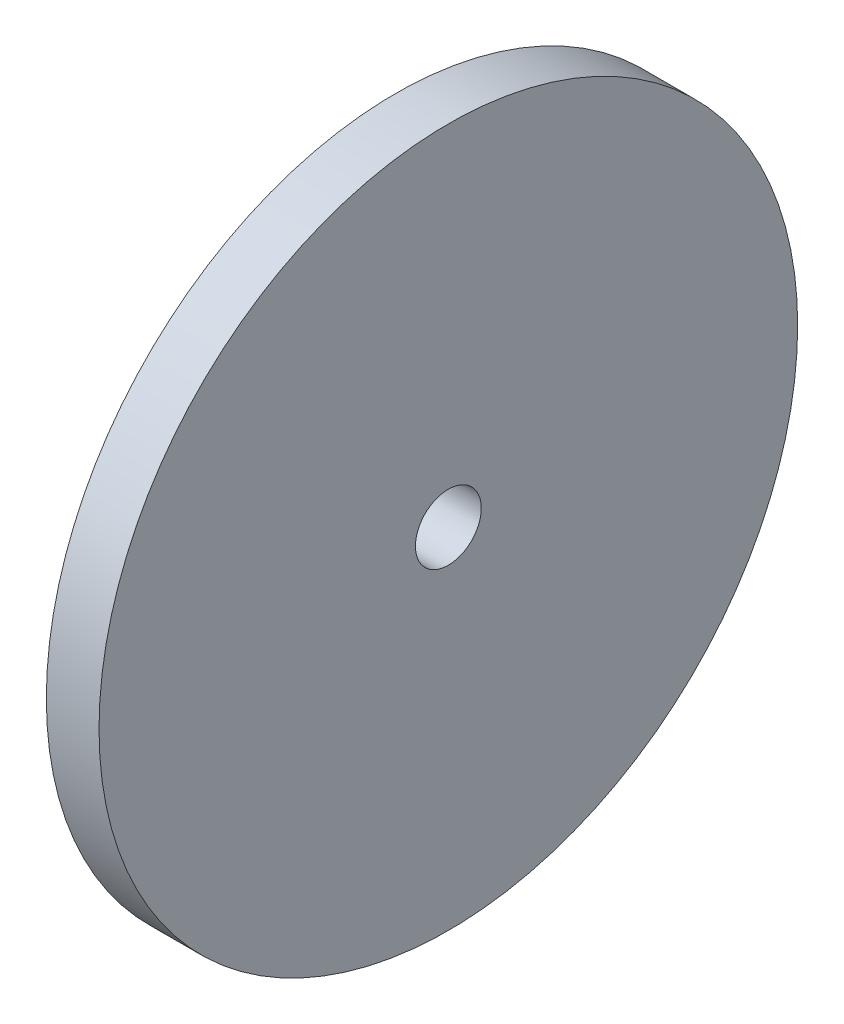
ISO-10303-21;
HEADER;
FILE_DESCRIPTION(('STEP AP214'),'2;1');
FILE_NAME('part.step','',(''),(''),'','','');
FILE_SCHEMA(('AUTOMOTIVE_DESIGN { 1 0 10303 214 1 1 1 1 }'));
ENDSEC;
DATA;
#1=APPLICATION_CONTEXT('core data for automotive mechanical design processes');
#2=APPLICATION_PROTOCOL_DEFINITION('international standard','automotive_design',2000,#1);
#3=PRODUCT_CONTEXT('',#1,'mechanical');
#4=PRODUCT('Part','Part','',(#3));
#5=PRODUCT_RELATED_PRODUCT_CATEGORY('part','',(#4));
#6=PRODUCT_DEFINITION_FORMATION('','',#4);
#7=PRODUCT_DEFINITION_CONTEXT('part definition',#1,'design');
#8=PRODUCT_DEFINITION('design','',#6,#7);
#9=PRODUCT_DEFINITION_SHAPE('','',#8);
#10=(LENGTH_UNIT() NAMED_UNIT(*) SI_UNIT(.MILLI.,.METRE.));
#11=(NAMED_UNIT(*) PLANE_ANGLE_UNIT() SI_UNIT($,.RADIAN.));
#12=(NAMED_UNIT(*) SI_UNIT($,.STERADIAN.) SOLID_ANGLE_UNIT());
#13=UNCERTAINTY_MEASURE_WITH_UNIT(LENGTH_MEASURE(1.E-05),#10,'distance_accuracy_value','');
#14=(GEOMETRIC_REPRESENTATION_CONTEXT(3) GLOBAL_UNCERTAINTY_ASSIGNED_CONTEXT((#13)) GLOBAL_UNIT_ASSIGNED_CONTEXT((#10,
#11,#12)) REPRESENTATION_CONTEXT('',''));
#15=CARTESIAN_POINT('',(0.,0.,0.));
#16=DIRECTION('',(0.,0.,1.));
#17=DIRECTION('',(1.,0.,0.));
#18=AXIS2_PLACEMENT_3D('',#15,#16,#17);
#19=CARTESIAN_POINT('',(0.,0.,0.));
#20=DIRECTION('',(1.,0.,0.));
#21=DIRECTION('',(0.,0.,-1.));
#22=AXIS2_PLACEMENT_3D('',#19,#20,#21);
#23=PLANE('',#22);
#24=CARTESIAN_POINT('',(0.,0.,0.));
#25=DIRECTION('',(-1.,0.,0.));
#26=DIRECTION('',(0.,0.,1.));
#27=AXIS2_PLACEMENT_3D('',#24,#25,#26);
#28=CIRCLE('',#27,1.5875);
#29=CARTESIAN_POINT('',(0.,0.,1.5875));
#30=VERTEX_POINT('',#29);
#31=EDGE_CURVE('E27',#30,#30,#28,.F.);
#32=ORIENTED_EDGE('',*,*,#31,.T.);
#33=EDGE_LOOP('',(#32));
#34=FACE_BOUND('',#33,.T.);
#35=CARTESIAN_POINT('',(0.,0.,0.));
#36=DIRECTION('',(-1.,0.,0.));
#37=DIRECTION('',(0.,0.,1.));
#38=AXIS2_PLACEMENT_3D('',#35,#36,#37);
#39=CIRCLE('',#38,16.843999967);
#40=CARTESIAN_POINT('',(0.,0.,16.843999967));
#41=VERTEX_POINT('',#40);
#42=EDGE_CURVE('E18',#41,#41,#39,.F.);
#43=ORIENTED_EDGE('',*,*,#42,.F.);
#44=EDGE_LOOP('',(#43));
#45=FACE_BOUND('',#44,.T.);
#46=ADVANCED_FACE('F15',(#34,#45),#23,.F.);
#47=CARTESIAN_POINT('',(2.54,0.,0.));
#48=DIRECTION('',(-1.,0.,0.));
#49=DIRECTION('',(0.,0.,1.));
#50=AXIS2_PLACEMENT_3D('',#47,#48,#49);
#51=CYLINDRICAL_SURFACE('',#50,16.843999967);
#52=ORIENTED_EDGE('',*,*,#42,.T.);
#53=EDGE_LOOP('',(#52));
#54=FACE_BOUND('',#53,.T.);
#55=CARTESIAN_POINT('',(2.54,0.,0.));
#56=DIRECTION('',(-1.,0.,0.));
#57=DIRECTION('',(0.,0.,1.));
#58=AXIS2_PLACEMENT_3D('',#55,#56,#57);
#59=CIRCLE('',#58,16.843999967);
#60=CARTESIAN_POINT('',(2.54,0.,16.843999967));
#61=VERTEX_POINT('',#60);
#62=EDGE_CURVE('E22',#61,#61,#59,.F.);
#63=ORIENTED_EDGE('',*,*,#62,.F.);
#64=EDGE_LOOP('',(#63));
#65=FACE_BOUND('',#64,.T.);
#66=ADVANCED_FACE('F35',(#54,#65),#51,.T.);
#67=CARTESIAN_POINT('',(2.54,0.,0.));
#68=DIRECTION('',(-1.,0.,0.));
#69=DIRECTION('',(0.,0.,1.));
#70=AXIS2_PLACEMENT_3D('',#67,#68,#69);
#71=CYLINDRICAL_SURFACE('',#70,1.5875);
#72=CARTESIAN_POINT('',(2.54,0.,0.));
#73=DIRECTION('',(-1.,0.,0.));
#74=DIRECTION('',(0.,0.,1.));
#75=AXIS2_PLACEMENT_3D('',#72,#73,#74);
#76=CIRCLE('',#75,1.5875);
#77=CARTESIAN_POINT('',(2.54,0.,1.5875));
#78=VERTEX_POINT('',#77);
#79=EDGE_CURVE('E10',#78,#78,#76,.T.);
#80=ORIENTED_EDGE('',*,*,#79,.F.);
#81=EDGE_LOOP('',(#80));
#82=FACE_BOUND('',#81,.T.);
#83=ORIENTED_EDGE('',*,*,#31,.F.);
#84=EDGE_LOOP('',(#83));
#85=FACE_BOUND('',#84,.T.);
#86=ADVANCED_FACE('F43',(#82,#85),#71,.F.);
#87=CARTESIAN_POINT('',(2.54,0.,0.));
#88=DIRECTION('',(1.,0.,0.));
#89=DIRECTION('',(0.,0.,-1.));
#90=AXIS2_PLACEMENT_3D('',#87,#88,#89);
#91=PLANE('',#90);
#92=ORIENTED_EDGE('',*,*,#79,.T.);
#93=EDGE_LOOP('',(#92));
#94=FACE_BOUND('',#93,.T.);
#95=ORIENTED_EDGE('',*,*,#62,.T.);
#96=EDGE_LOOP('',(#95));
#97=FACE_BOUND('',#96,.T.);
#98=ADVANCED_FACE('F44',(#94,#97),#91,.T.);
#99=CLOSED_SHELL('',(#46,#66,#86,#98));
#100=MANIFOLD_SOLID_BREP('B1',#99);
#101=ADVANCED_BREP_SHAPE_REPRESENTATION('',(#18,#100),#14);
#102=SHAPE_DEFINITION_REPRESENTATION(#9,#101);
ENDSEC;
END-ISO-10303-21;
